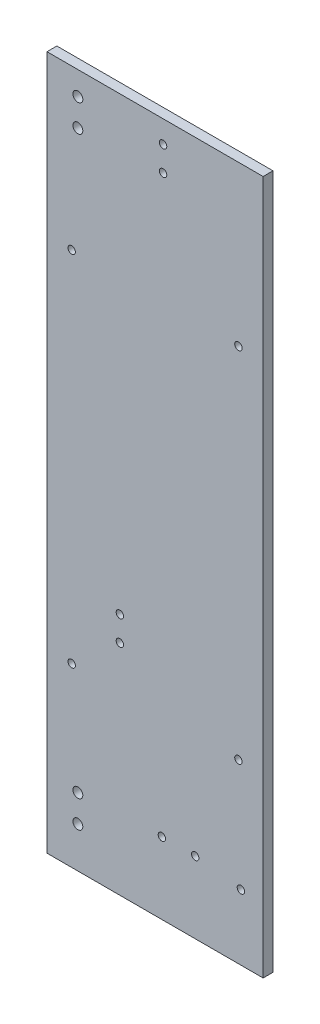
ISO-10303-21;
HEADER;
FILE_DESCRIPTION(('STEP AP214'),'2;1');
FILE_NAME('part.step','',(''),(''),'','','');
FILE_SCHEMA(('AUTOMOTIVE_DESIGN { 1 0 10303 214 1 1 1 1 }'));
ENDSEC;
DATA;
#1=APPLICATION_CONTEXT('core data for automotive mechanical design processes');
#2=APPLICATION_PROTOCOL_DEFINITION('international standard','automotive_design',2000,#1);
#3=PRODUCT_CONTEXT('',#1,'mechanical');
#4=PRODUCT('Part','Part','',(#3));
#5=PRODUCT_RELATED_PRODUCT_CATEGORY('part','',(#4));
#6=PRODUCT_DEFINITION_FORMATION('','',#4);
#7=PRODUCT_DEFINITION_CONTEXT('part definition',#1,'design');
#8=PRODUCT_DEFINITION('design','',#6,#7);
#9=PRODUCT_DEFINITION_SHAPE('','',#8);
#10=(LENGTH_UNIT() NAMED_UNIT(*) SI_UNIT(.MILLI.,.METRE.));
#11=(NAMED_UNIT(*) PLANE_ANGLE_UNIT() SI_UNIT($,.RADIAN.));
#12=(NAMED_UNIT(*) SI_UNIT($,.STERADIAN.) SOLID_ANGLE_UNIT());
#13=UNCERTAINTY_MEASURE_WITH_UNIT(LENGTH_MEASURE(1.E-05),#10,'distance_accuracy_value','');
#14=(GEOMETRIC_REPRESENTATION_CONTEXT(3) GLOBAL_UNCERTAINTY_ASSIGNED_CONTEXT((#13)) GLOBAL_UNIT_ASSIGNED_CONTEXT((#10,
#11,#12)) REPRESENTATION_CONTEXT('',''));
#15=CARTESIAN_POINT('',(0.,0.,0.));
#16=DIRECTION('',(0.,0.,1.));
#17=DIRECTION('',(1.,0.,0.));
#18=AXIS2_PLACEMENT_3D('',#15,#16,#17);
#19=CARTESIAN_POINT('',(-17.0907916429936,-246.819578947368,4.));
#20=DIRECTION('',(0.,0.,1.));
#21=DIRECTION('',(1.,0.,0.));
#22=AXIS2_PLACEMENT_3D('',#19,#20,#21);
#23=PLANE('',#22);
#24=CARTESIAN_POINT('',(12.4092083570064,-148.319578947368,4.));
#25=DIRECTION('',(0.,0.,1.));
#26=DIRECTION('',(1.,0.,0.));
#27=AXIS2_PLACEMENT_3D('',#24,#25,#26);
#28=CIRCLE('',#27,1.5);
#29=CARTESIAN_POINT('',(13.9092083570064,-148.319578947368,4.));
#30=VERTEX_POINT('',#29);
#31=EDGE_CURVE('E184',#30,#30,#28,.T.);
#32=ORIENTED_EDGE('',*,*,#31,.F.);
#33=EDGE_LOOP('',(#32));
#34=FACE_BOUND('',#33,.T.);
#35=CARTESIAN_POINT('',(29.9092083570063,25.1804210526316,4.));
#36=DIRECTION('',(0.,0.,1.));
#37=DIRECTION('',(1.,0.,0.));
#38=AXIS2_PLACEMENT_3D('',#35,#36,#37);
#39=CIRCLE('',#38,1.5);
#40=CARTESIAN_POINT('',(31.4092083570063,25.1804210526316,4.));
#41=VERTEX_POINT('',#40);
#42=EDGE_CURVE('E172',#41,#41,#39,.T.);
#43=ORIENTED_EDGE('',*,*,#42,.F.);
#44=EDGE_LOOP('',(#43));
#45=FACE_BOUND('',#44,.T.);
#46=CARTESIAN_POINT('',(-4.59079164299366,24.6804210526316,4.));
#47=DIRECTION('',(0.,0.,1.));
#48=DIRECTION('',(1.,0.,0.));
#49=AXIS2_PLACEMENT_3D('',#46,#47,#48);
#50=CIRCLE('',#49,2.);
#51=CARTESIAN_POINT('',(-2.59079164299365,24.6804210526316,4.));
#52=VERTEX_POINT('',#51);
#53=EDGE_CURVE('E160',#52,#52,#50,.T.);
#54=ORIENTED_EDGE('',*,*,#53,.F.);
#55=EDGE_LOOP('',(#54));
#56=FACE_BOUND('',#55,.T.);
#57=CARTESIAN_POINT('',(-4.59079164299362,-219.319578947368,4.));
#58=DIRECTION('',(0.,0.,1.));
#59=DIRECTION('',(1.,0.,0.));
#60=AXIS2_PLACEMENT_3D('',#57,#58,#59);
#61=CIRCLE('',#60,2.);
#62=CARTESIAN_POINT('',(-2.59079164299362,-219.319578947368,4.));
#63=VERTEX_POINT('',#62);
#64=EDGE_CURVE('E148',#63,#63,#61,.T.);
#65=ORIENTED_EDGE('',*,*,#64,.F.);
#66=EDGE_LOOP('',(#65));
#67=FACE_BOUND('',#66,.T.);
#68=CARTESIAN_POINT('',(29.4092083570064,-217.819578947368,4.));
#69=DIRECTION('',(0.,0.,1.));
#70=DIRECTION('',(1.,0.,0.));
#71=AXIS2_PLACEMENT_3D('',#68,#69,#70);
#72=CIRCLE('',#71,1.5);
#73=CARTESIAN_POINT('',(30.9092083570064,-217.819578947368,4.));
#74=VERTEX_POINT('',#73);
#75=EDGE_CURVE('E136',#74,#74,#72,.T.);
#76=ORIENTED_EDGE('',*,*,#75,.F.);
#77=EDGE_LOOP('',(#76));
#78=FACE_BOUND('',#77,.T.);
#79=CARTESIAN_POINT('',(60.4092083570064,-175.319578947368,4.));
#80=DIRECTION('',(0.,0.,1.));
#81=DIRECTION('',(1.,0.,0.));
#82=AXIS2_PLACEMENT_3D('',#79,#80,#81);
#83=CIRCLE('',#82,1.5);
#84=CARTESIAN_POINT('',(61.9092083570064,-175.319578947368,4.));
#85=VERTEX_POINT('',#84);
#86=EDGE_CURVE('E124',#85,#85,#83,.T.);
#87=ORIENTED_EDGE('',*,*,#86,.F.);
#88=EDGE_LOOP('',(#87));
#89=FACE_BOUND('',#88,.T.);
#90=CARTESIAN_POINT('',(-7.09079164299365,-30.3195789473684,4.));
#91=DIRECTION('',(0.,0.,1.));
#92=DIRECTION('',(1.,0.,0.));
#93=AXIS2_PLACEMENT_3D('',#90,#91,#92);
#94=CIRCLE('',#93,1.5);
#95=CARTESIAN_POINT('',(-5.59079164299365,-30.3195789473684,4.));
#96=VERTEX_POINT('',#95);
#97=EDGE_CURVE('E112',#96,#96,#94,.T.);
#98=ORIENTED_EDGE('',*,*,#97,.F.);
#99=EDGE_LOOP('',(#98));
#100=FACE_BOUND('',#99,.T.);
#101=DIRECTION('',(0.,-1.,0.));
#102=VECTOR('',#101,1.);
#103=CARTESIAN_POINT('',(-17.0907916429937,34.1804210526316,4.));
#104=LINE('',#103,#102);
#105=CARTESIAN_POINT('',(-17.0907916429937,34.1804210526316,4.));
#106=VERTEX_POINT('',#105);
#107=CARTESIAN_POINT('',(-17.0907916429936,-246.819578947368,4.));
#108=VERTEX_POINT('',#107);
#109=EDGE_CURVE('E82',#106,#108,#104,.T.);
#110=ORIENTED_EDGE('',*,*,#109,.T.);
#111=DIRECTION('',(1.,0.,0.));
#112=VECTOR('',#111,1.);
#113=CARTESIAN_POINT('',(-17.0907916429936,-246.819578947368,4.));
#114=LINE('',#113,#112);
#115=CARTESIAN_POINT('',(70.4092083570064,-246.819578947368,4.));
#116=VERTEX_POINT('',#115);
#117=EDGE_CURVE('E77',#108,#116,#114,.T.);
#118=ORIENTED_EDGE('',*,*,#117,.T.);
#119=DIRECTION('',(0.,1.,0.));
#120=VECTOR('',#119,1.);
#121=CARTESIAN_POINT('',(70.4092083570063,34.1804210526316,4.));
#122=LINE('',#121,#120);
#123=CARTESIAN_POINT('',(70.4092083570063,34.1804210526316,4.));
#124=VERTEX_POINT('',#123);
#125=EDGE_CURVE('E80',#116,#124,#122,.T.);
#126=ORIENTED_EDGE('',*,*,#125,.T.);
#127=DIRECTION('',(-1.,0.,0.));
#128=VECTOR('',#127,1.);
#129=CARTESIAN_POINT('',(-17.0907916429937,34.1804210526316,4.));
#130=LINE('',#129,#128);
#131=EDGE_CURVE('E47',#124,#106,#130,.T.);
#132=ORIENTED_EDGE('',*,*,#131,.T.);
#133=EDGE_LOOP('',(#110,#118,#126,#132));
#134=FACE_BOUND('',#133,.T.);
#135=CARTESIAN_POINT('',(-7.09079164299363,-175.319578947368,4.));
#136=DIRECTION('',(0.,0.,1.));
#137=DIRECTION('',(1.,0.,0.));
#138=AXIS2_PLACEMENT_3D('',#135,#136,#137);
#139=CIRCLE('',#138,1.5);
#140=CARTESIAN_POINT('',(-5.59079164299363,-175.319578947368,4.));
#141=VERTEX_POINT('',#140);
#142=EDGE_CURVE('E97',#141,#141,#139,.T.);
#143=ORIENTED_EDGE('',*,*,#142,.F.);
#144=EDGE_LOOP('',(#143));
#145=FACE_BOUND('',#144,.T.);
#146=CARTESIAN_POINT('',(60.4092083570064,-30.3195789473684,4.));
#147=DIRECTION('',(0.,0.,1.));
#148=DIRECTION('',(1.,0.,0.));
#149=AXIS2_PLACEMENT_3D('',#146,#147,#148);
#150=CIRCLE('',#149,1.5);
#151=CARTESIAN_POINT('',(61.9092083570064,-30.3195789473684,4.));
#152=VERTEX_POINT('',#151);
#153=EDGE_CURVE('E118',#152,#152,#150,.T.);
#154=ORIENTED_EDGE('',*,*,#153,.F.);
#155=EDGE_LOOP('',(#154));
#156=FACE_BOUND('',#155,.T.);
#157=CARTESIAN_POINT('',(42.9092083570064,-217.819578947368,4.));
#158=DIRECTION('',(0.,0.,1.));
#159=DIRECTION('',(1.,0.,0.));
#160=AXIS2_PLACEMENT_3D('',#157,#158,#159);
#161=CIRCLE('',#160,1.5);
#162=CARTESIAN_POINT('',(44.4092083570064,-217.819578947368,4.));
#163=VERTEX_POINT('',#162);
#164=EDGE_CURVE('E130',#163,#163,#161,.T.);
#165=ORIENTED_EDGE('',*,*,#164,.F.);
#166=EDGE_LOOP('',(#165));
#167=FACE_BOUND('',#166,.T.);
#168=CARTESIAN_POINT('',(61.4092083570064,-220.319578947368,4.));
#169=DIRECTION('',(0.,0.,1.));
#170=DIRECTION('',(1.,0.,0.));
#171=AXIS2_PLACEMENT_3D('',#168,#169,#170);
#172=CIRCLE('',#171,1.49999999999999);
#173=CARTESIAN_POINT('',(62.9092083570064,-220.319578947368,4.));
#174=VERTEX_POINT('',#173);
#175=EDGE_CURVE('E142',#174,#174,#172,.T.);
#176=ORIENTED_EDGE('',*,*,#175,.F.);
#177=EDGE_LOOP('',(#176));
#178=FACE_BOUND('',#177,.T.);
#179=CARTESIAN_POINT('',(-4.59079164299362,-230.319578947368,4.));
#180=DIRECTION('',(0.,0.,1.));
#181=DIRECTION('',(1.,0.,0.));
#182=AXIS2_PLACEMENT_3D('',#179,#180,#181);
#183=CIRCLE('',#182,2.);
#184=CARTESIAN_POINT('',(-2.59079164299362,-230.319578947368,4.));
#185=VERTEX_POINT('',#184);
#186=EDGE_CURVE('E154',#185,#185,#183,.T.);
#187=ORIENTED_EDGE('',*,*,#186,.F.);
#188=EDGE_LOOP('',(#187));
#189=FACE_BOUND('',#188,.T.);
#190=CARTESIAN_POINT('',(-4.59079164299365,13.6804210526316,4.));
#191=DIRECTION('',(0.,0.,1.));
#192=DIRECTION('',(1.,0.,0.));
#193=AXIS2_PLACEMENT_3D('',#190,#191,#192);
#194=CIRCLE('',#193,2.);
#195=CARTESIAN_POINT('',(-2.59079164299365,13.6804210526316,4.));
#196=VERTEX_POINT('',#195);
#197=EDGE_CURVE('E166',#196,#196,#194,.T.);
#198=ORIENTED_EDGE('',*,*,#197,.F.);
#199=EDGE_LOOP('',(#198));
#200=FACE_BOUND('',#199,.T.);
#201=CARTESIAN_POINT('',(29.9092083570063,15.1804210526316,4.));
#202=DIRECTION('',(0.,0.,1.));
#203=DIRECTION('',(1.,0.,0.));
#204=AXIS2_PLACEMENT_3D('',#201,#202,#203);
#205=CIRCLE('',#204,1.5);
#206=CARTESIAN_POINT('',(31.4092083570063,15.1804210526316,4.));
#207=VERTEX_POINT('',#206);
#208=EDGE_CURVE('E178',#207,#207,#205,.T.);
#209=ORIENTED_EDGE('',*,*,#208,.F.);
#210=EDGE_LOOP('',(#209));
#211=FACE_BOUND('',#210,.T.);
#212=CARTESIAN_POINT('',(12.4092083570064,-158.319578947368,4.));
#213=DIRECTION('',(0.,0.,1.));
#214=DIRECTION('',(1.,0.,0.));
#215=AXIS2_PLACEMENT_3D('',#212,#213,#214);
#216=CIRCLE('',#215,1.5);
#217=CARTESIAN_POINT('',(13.9092083570064,-158.319578947368,4.));
#218=VERTEX_POINT('',#217);
#219=EDGE_CURVE('E190',#218,#218,#216,.T.);
#220=ORIENTED_EDGE('',*,*,#219,.F.);
#221=EDGE_LOOP('',(#220));
#222=FACE_BOUND('',#221,.T.);
#223=ADVANCED_FACE('F30',(#34,#45,#56,#67,#78,#89,#100,#134,#145,#156,#167,#178,#189,#200,#211,
#222),#23,.T.);
#224=CARTESIAN_POINT('',(-17.0907916429936,-246.819578947368,0.));
#225=DIRECTION('',(0.,0.,1.));
#226=DIRECTION('',(1.,0.,0.));
#227=AXIS2_PLACEMENT_3D('',#224,#225,#226);
#228=PLANE('',#227);
#229=CARTESIAN_POINT('',(12.4092083570064,-148.319578947368,0.));
#230=DIRECTION('',(0.,0.,1.));
#231=DIRECTION('',(1.,0.,0.));
#232=AXIS2_PLACEMENT_3D('',#229,#230,#231);
#233=CIRCLE('',#232,1.5);
#234=CARTESIAN_POINT('',(13.9092083570064,-148.319578947368,0.));
#235=VERTEX_POINT('',#234);
#236=EDGE_CURVE('E187',#235,#235,#233,.T.);
#237=ORIENTED_EDGE('',*,*,#236,.T.);
#238=EDGE_LOOP('',(#237));
#239=FACE_BOUND('',#238,.T.);
#240=CARTESIAN_POINT('',(29.9092083570063,25.1804210526316,0.));
#241=DIRECTION('',(0.,0.,1.));
#242=DIRECTION('',(1.,0.,0.));
#243=AXIS2_PLACEMENT_3D('',#240,#241,#242);
#244=CIRCLE('',#243,1.5);
#245=CARTESIAN_POINT('',(31.4092083570063,25.1804210526316,0.));
#246=VERTEX_POINT('',#245);
#247=EDGE_CURVE('E175',#246,#246,#244,.T.);
#248=ORIENTED_EDGE('',*,*,#247,.T.);
#249=EDGE_LOOP('',(#248));
#250=FACE_BOUND('',#249,.T.);
#251=CARTESIAN_POINT('',(-4.59079164299366,24.6804210526316,0.));
#252=DIRECTION('',(0.,0.,1.));
#253=DIRECTION('',(1.,0.,0.));
#254=AXIS2_PLACEMENT_3D('',#251,#252,#253);
#255=CIRCLE('',#254,2.);
#256=CARTESIAN_POINT('',(-2.59079164299365,24.6804210526316,0.));
#257=VERTEX_POINT('',#256);
#258=EDGE_CURVE('E163',#257,#257,#255,.T.);
#259=ORIENTED_EDGE('',*,*,#258,.T.);
#260=EDGE_LOOP('',(#259));
#261=FACE_BOUND('',#260,.T.);
#262=CARTESIAN_POINT('',(-4.59079164299362,-219.319578947368,0.));
#263=DIRECTION('',(0.,0.,1.));
#264=DIRECTION('',(1.,0.,0.));
#265=AXIS2_PLACEMENT_3D('',#262,#263,#264);
#266=CIRCLE('',#265,2.);
#267=CARTESIAN_POINT('',(-2.59079164299362,-219.319578947368,0.));
#268=VERTEX_POINT('',#267);
#269=EDGE_CURVE('E151',#268,#268,#266,.T.);
#270=ORIENTED_EDGE('',*,*,#269,.T.);
#271=EDGE_LOOP('',(#270));
#272=FACE_BOUND('',#271,.T.);
#273=CARTESIAN_POINT('',(29.4092083570064,-217.819578947368,0.));
#274=DIRECTION('',(0.,0.,1.));
#275=DIRECTION('',(1.,0.,0.));
#276=AXIS2_PLACEMENT_3D('',#273,#274,#275);
#277=CIRCLE('',#276,1.5);
#278=CARTESIAN_POINT('',(30.9092083570064,-217.819578947368,0.));
#279=VERTEX_POINT('',#278);
#280=EDGE_CURVE('E139',#279,#279,#277,.T.);
#281=ORIENTED_EDGE('',*,*,#280,.T.);
#282=EDGE_LOOP('',(#281));
#283=FACE_BOUND('',#282,.T.);
#284=CARTESIAN_POINT('',(60.4092083570064,-175.319578947368,0.));
#285=DIRECTION('',(0.,0.,1.));
#286=DIRECTION('',(1.,0.,0.));
#287=AXIS2_PLACEMENT_3D('',#284,#285,#286);
#288=CIRCLE('',#287,1.5);
#289=CARTESIAN_POINT('',(61.9092083570064,-175.319578947368,0.));
#290=VERTEX_POINT('',#289);
#291=EDGE_CURVE('E127',#290,#290,#288,.T.);
#292=ORIENTED_EDGE('',*,*,#291,.T.);
#293=EDGE_LOOP('',(#292));
#294=FACE_BOUND('',#293,.T.);
#295=CARTESIAN_POINT('',(-7.09079164299365,-30.3195789473684,0.));
#296=DIRECTION('',(0.,0.,1.));
#297=DIRECTION('',(1.,0.,0.));
#298=AXIS2_PLACEMENT_3D('',#295,#296,#297);
#299=CIRCLE('',#298,1.5);
#300=CARTESIAN_POINT('',(-5.59079164299365,-30.3195789473684,0.));
#301=VERTEX_POINT('',#300);
#302=EDGE_CURVE('E115',#301,#301,#299,.T.);
#303=ORIENTED_EDGE('',*,*,#302,.T.);
#304=EDGE_LOOP('',(#303));
#305=FACE_BOUND('',#304,.T.);
#306=DIRECTION('',(0.,-1.,0.));
#307=VECTOR('',#306,1.);
#308=CARTESIAN_POINT('',(-17.0907916429937,34.1804210526316,0.));
#309=LINE('',#308,#307);
#310=CARTESIAN_POINT('',(-17.0907916429937,34.1804210526316,0.));
#311=VERTEX_POINT('',#310);
#312=CARTESIAN_POINT('',(-17.0907916429936,-246.819578947368,0.));
#313=VERTEX_POINT('',#312);
#314=EDGE_CURVE('E94',#311,#313,#309,.T.);
#315=ORIENTED_EDGE('',*,*,#314,.F.);
#316=DIRECTION('',(-1.,0.,0.));
#317=VECTOR('',#316,1.);
#318=CARTESIAN_POINT('',(-17.0907916429937,34.1804210526316,0.));
#319=LINE('',#318,#317);
#320=CARTESIAN_POINT('',(70.4092083570063,34.1804210526316,0.));
#321=VERTEX_POINT('',#320);
#322=EDGE_CURVE('E70',#321,#311,#319,.T.);
#323=ORIENTED_EDGE('',*,*,#322,.F.);
#324=DIRECTION('',(0.,1.,0.));
#325=VECTOR('',#324,1.);
#326=CARTESIAN_POINT('',(70.4092083570063,34.1804210526316,0.));
#327=LINE('',#326,#325);
#328=CARTESIAN_POINT('',(70.4092083570064,-246.819578947368,0.));
#329=VERTEX_POINT('',#328);
#330=EDGE_CURVE('E64',#329,#321,#327,.T.);
#331=ORIENTED_EDGE('',*,*,#330,.F.);
#332=DIRECTION('',(1.,0.,0.));
#333=VECTOR('',#332,1.);
#334=CARTESIAN_POINT('',(-17.0907916429936,-246.819578947368,0.));
#335=LINE('',#334,#333);
#336=EDGE_CURVE('E86',#313,#329,#335,.T.);
#337=ORIENTED_EDGE('',*,*,#336,.F.);
#338=EDGE_LOOP('',(#315,#323,#331,#337));
#339=FACE_BOUND('',#338,.T.);
#340=CARTESIAN_POINT('',(-7.09079164299363,-175.319578947368,0.));
#341=DIRECTION('',(0.,0.,1.));
#342=DIRECTION('',(1.,0.,0.));
#343=AXIS2_PLACEMENT_3D('',#340,#341,#342);
#344=CIRCLE('',#343,1.5);
#345=CARTESIAN_POINT('',(-5.59079164299363,-175.319578947368,0.));
#346=VERTEX_POINT('',#345);
#347=EDGE_CURVE('E109',#346,#346,#344,.T.);
#348=ORIENTED_EDGE('',*,*,#347,.T.);
#349=EDGE_LOOP('',(#348));
#350=FACE_BOUND('',#349,.T.);
#351=CARTESIAN_POINT('',(60.4092083570064,-30.3195789473684,0.));
#352=DIRECTION('',(0.,0.,1.));
#353=DIRECTION('',(1.,0.,0.));
#354=AXIS2_PLACEMENT_3D('',#351,#352,#353);
#355=CIRCLE('',#354,1.5);
#356=CARTESIAN_POINT('',(61.9092083570064,-30.3195789473684,0.));
#357=VERTEX_POINT('',#356);
#358=EDGE_CURVE('E121',#357,#357,#355,.T.);
#359=ORIENTED_EDGE('',*,*,#358,.T.);
#360=EDGE_LOOP('',(#359));
#361=FACE_BOUND('',#360,.T.);
#362=CARTESIAN_POINT('',(42.9092083570064,-217.819578947368,0.));
#363=DIRECTION('',(0.,0.,1.));
#364=DIRECTION('',(1.,0.,0.));
#365=AXIS2_PLACEMENT_3D('',#362,#363,#364);
#366=CIRCLE('',#365,1.5);
#367=CARTESIAN_POINT('',(44.4092083570064,-217.819578947368,0.));
#368=VERTEX_POINT('',#367);
#369=EDGE_CURVE('E133',#368,#368,#366,.T.);
#370=ORIENTED_EDGE('',*,*,#369,.T.);
#371=EDGE_LOOP('',(#370));
#372=FACE_BOUND('',#371,.T.);
#373=CARTESIAN_POINT('',(61.4092083570064,-220.319578947368,0.));
#374=DIRECTION('',(0.,0.,1.));
#375=DIRECTION('',(1.,0.,0.));
#376=AXIS2_PLACEMENT_3D('',#373,#374,#375);
#377=CIRCLE('',#376,1.49999999999999);
#378=CARTESIAN_POINT('',(62.9092083570064,-220.319578947368,0.));
#379=VERTEX_POINT('',#378);
#380=EDGE_CURVE('E145',#379,#379,#377,.T.);
#381=ORIENTED_EDGE('',*,*,#380,.T.);
#382=EDGE_LOOP('',(#381));
#383=FACE_BOUND('',#382,.T.);
#384=CARTESIAN_POINT('',(-4.59079164299362,-230.319578947368,0.));
#385=DIRECTION('',(0.,0.,1.));
#386=DIRECTION('',(1.,0.,0.));
#387=AXIS2_PLACEMENT_3D('',#384,#385,#386);
#388=CIRCLE('',#387,2.);
#389=CARTESIAN_POINT('',(-2.59079164299362,-230.319578947368,0.));
#390=VERTEX_POINT('',#389);
#391=EDGE_CURVE('E157',#390,#390,#388,.T.);
#392=ORIENTED_EDGE('',*,*,#391,.T.);
#393=EDGE_LOOP('',(#392));
#394=FACE_BOUND('',#393,.T.);
#395=CARTESIAN_POINT('',(-4.59079164299365,13.6804210526316,0.));
#396=DIRECTION('',(0.,0.,1.));
#397=DIRECTION('',(1.,0.,0.));
#398=AXIS2_PLACEMENT_3D('',#395,#396,#397);
#399=CIRCLE('',#398,2.);
#400=CARTESIAN_POINT('',(-2.59079164299365,13.6804210526316,0.));
#401=VERTEX_POINT('',#400);
#402=EDGE_CURVE('E169',#401,#401,#399,.T.);
#403=ORIENTED_EDGE('',*,*,#402,.T.);
#404=EDGE_LOOP('',(#403));
#405=FACE_BOUND('',#404,.T.);
#406=CARTESIAN_POINT('',(29.9092083570063,15.1804210526316,0.));
#407=DIRECTION('',(0.,0.,1.));
#408=DIRECTION('',(1.,0.,0.));
#409=AXIS2_PLACEMENT_3D('',#406,#407,#408);
#410=CIRCLE('',#409,1.5);
#411=CARTESIAN_POINT('',(31.4092083570063,15.1804210526316,0.));
#412=VERTEX_POINT('',#411);
#413=EDGE_CURVE('E181',#412,#412,#410,.T.);
#414=ORIENTED_EDGE('',*,*,#413,.T.);
#415=EDGE_LOOP('',(#414));
#416=FACE_BOUND('',#415,.T.);
#417=CARTESIAN_POINT('',(12.4092083570064,-158.319578947368,0.));
#418=DIRECTION('',(0.,0.,1.));
#419=DIRECTION('',(1.,0.,0.));
#420=AXIS2_PLACEMENT_3D('',#417,#418,#419);
#421=CIRCLE('',#420,1.5);
#422=CARTESIAN_POINT('',(13.9092083570064,-158.319578947368,0.));
#423=VERTEX_POINT('',#422);
#424=EDGE_CURVE('E193',#423,#423,#421,.T.);
#425=ORIENTED_EDGE('',*,*,#424,.T.);
#426=EDGE_LOOP('',(#425));
#427=FACE_BOUND('',#426,.T.);
#428=ADVANCED_FACE('F105',(#239,#250,#261,#272,#283,#294,#305,#339,#350,#361,#372,#383,#394,
#405,#416,#427),#228,.F.);
#429=CARTESIAN_POINT('',(-17.0907916429937,34.1804210526316,4.));
#430=DIRECTION('',(1.,0.,0.));
#431=DIRECTION('',(0.,1.,0.));
#432=AXIS2_PLACEMENT_3D('',#429,#430,#431);
#433=PLANE('',#432);
#434=ORIENTED_EDGE('',*,*,#314,.T.);
#435=DIRECTION('',(0.,0.,-1.));
#436=VECTOR('',#435,1.);
#437=CARTESIAN_POINT('',(-17.0907916429936,-246.819578947368,4.));
#438=LINE('',#437,#436);
#439=EDGE_CURVE('E11',#108,#313,#438,.T.);
#440=ORIENTED_EDGE('',*,*,#439,.F.);
#441=ORIENTED_EDGE('',*,*,#109,.F.);
#442=DIRECTION('',(0.,0.,-1.));
#443=VECTOR('',#442,1.);
#444=CARTESIAN_POINT('',(-17.0907916429937,34.1804210526316,4.));
#445=LINE('',#444,#443);
#446=EDGE_CURVE('E90',#106,#311,#445,.T.);
#447=ORIENTED_EDGE('',*,*,#446,.T.);
#448=EDGE_LOOP('',(#434,#440,#441,#447));
#449=FACE_BOUND('',#448,.T.);
#450=ADVANCED_FACE('F32',(#449),#433,.F.);
#451=CARTESIAN_POINT('',(-17.0907916429936,-246.819578947368,4.));
#452=DIRECTION('',(0.,1.,0.));
#453=DIRECTION('',(0.,0.,1.));
#454=AXIS2_PLACEMENT_3D('',#451,#452,#453);
#455=PLANE('',#454);
#456=ORIENTED_EDGE('',*,*,#336,.T.);
#457=DIRECTION('',(0.,0.,-1.));
#458=VECTOR('',#457,1.);
#459=CARTESIAN_POINT('',(70.4092083570064,-246.819578947368,4.));
#460=LINE('',#459,#458);
#461=EDGE_CURVE('E39',#116,#329,#460,.T.);
#462=ORIENTED_EDGE('',*,*,#461,.F.);
#463=ORIENTED_EDGE('',*,*,#117,.F.);
#464=ORIENTED_EDGE('',*,*,#439,.T.);
#465=EDGE_LOOP('',(#456,#462,#463,#464));
#466=FACE_BOUND('',#465,.T.);
#467=ADVANCED_FACE('F85',(#466),#455,.F.);
#468=CARTESIAN_POINT('',(70.4092083570063,34.1804210526316,4.));
#469=DIRECTION('',(-1.,0.,0.));
#470=DIRECTION('',(0.,-1.,0.));
#471=AXIS2_PLACEMENT_3D('',#468,#469,#470);
#472=PLANE('',#471);
#473=ORIENTED_EDGE('',*,*,#330,.T.);
#474=DIRECTION('',(0.,0.,-1.));
#475=VECTOR('',#474,1.);
#476=CARTESIAN_POINT('',(70.4092083570063,34.1804210526316,4.));
#477=LINE('',#476,#475);
#478=EDGE_CURVE('E87',#124,#321,#477,.T.);
#479=ORIENTED_EDGE('',*,*,#478,.F.);
#480=ORIENTED_EDGE('',*,*,#125,.F.);
#481=ORIENTED_EDGE('',*,*,#461,.T.);
#482=EDGE_LOOP('',(#473,#479,#480,#481));
#483=FACE_BOUND('',#482,.T.);
#484=ADVANCED_FACE('F88',(#483),#472,.F.);
#485=CARTESIAN_POINT('',(-17.0907916429937,34.1804210526316,4.));
#486=DIRECTION('',(0.,-1.,0.));
#487=DIRECTION('',(0.,0.,-1.));
#488=AXIS2_PLACEMENT_3D('',#485,#486,#487);
#489=PLANE('',#488);
#490=ORIENTED_EDGE('',*,*,#322,.T.);
#491=ORIENTED_EDGE('',*,*,#446,.F.);
#492=ORIENTED_EDGE('',*,*,#131,.F.);
#493=ORIENTED_EDGE('',*,*,#478,.T.);
#494=EDGE_LOOP('',(#490,#491,#492,#493));
#495=FACE_BOUND('',#494,.T.);
#496=ADVANCED_FACE('F102',(#495),#489,.F.);
#497=CARTESIAN_POINT('',(-7.09079164299363,-175.319578947368,4.));
#498=DIRECTION('',(0.,0.,-1.));
#499=DIRECTION('',(-1.,0.,0.));
#500=AXIS2_PLACEMENT_3D('',#497,#498,#499);
#501=CYLINDRICAL_SURFACE('',#500,1.5);
#502=ORIENTED_EDGE('',*,*,#142,.T.);
#503=EDGE_LOOP('',(#502));
#504=FACE_BOUND('',#503,.T.);
#505=ORIENTED_EDGE('',*,*,#347,.F.);
#506=EDGE_LOOP('',(#505));
#507=FACE_BOUND('',#506,.T.);
#508=ADVANCED_FACE('F213',(#504,#507),#501,.F.);
#509=CARTESIAN_POINT('',(-7.09079164299365,-30.3195789473684,4.));
#510=DIRECTION('',(0.,0.,-1.));
#511=DIRECTION('',(-1.,0.,0.));
#512=AXIS2_PLACEMENT_3D('',#509,#510,#511);
#513=CYLINDRICAL_SURFACE('',#512,1.5);
#514=ORIENTED_EDGE('',*,*,#97,.T.);
#515=EDGE_LOOP('',(#514));
#516=FACE_BOUND('',#515,.T.);
#517=ORIENTED_EDGE('',*,*,#302,.F.);
#518=EDGE_LOOP('',(#517));
#519=FACE_BOUND('',#518,.T.);
#520=ADVANCED_FACE('F259',(#516,#519),#513,.F.);
#521=CARTESIAN_POINT('',(60.4092083570064,-30.3195789473684,4.));
#522=DIRECTION('',(0.,0.,-1.));
#523=DIRECTION('',(-1.,0.,0.));
#524=AXIS2_PLACEMENT_3D('',#521,#522,#523);
#525=CYLINDRICAL_SURFACE('',#524,1.5);
#526=ORIENTED_EDGE('',*,*,#153,.T.);
#527=EDGE_LOOP('',(#526));
#528=FACE_BOUND('',#527,.T.);
#529=ORIENTED_EDGE('',*,*,#358,.F.);
#530=EDGE_LOOP('',(#529));
#531=FACE_BOUND('',#530,.T.);
#532=ADVANCED_FACE('F267',(#528,#531),#525,.F.);
#533=CARTESIAN_POINT('',(60.4092083570064,-175.319578947368,4.));
#534=DIRECTION('',(0.,0.,-1.));
#535=DIRECTION('',(-1.,0.,0.));
#536=AXIS2_PLACEMENT_3D('',#533,#534,#535);
#537=CYLINDRICAL_SURFACE('',#536,1.5);
#538=ORIENTED_EDGE('',*,*,#86,.T.);
#539=EDGE_LOOP('',(#538));
#540=FACE_BOUND('',#539,.T.);
#541=ORIENTED_EDGE('',*,*,#291,.F.);
#542=EDGE_LOOP('',(#541));
#543=FACE_BOUND('',#542,.T.);
#544=ADVANCED_FACE('F275',(#540,#543),#537,.F.);
#545=CARTESIAN_POINT('',(42.9092083570064,-217.819578947368,4.));
#546=DIRECTION('',(0.,0.,-1.));
#547=DIRECTION('',(-1.,0.,0.));
#548=AXIS2_PLACEMENT_3D('',#545,#546,#547);
#549=CYLINDRICAL_SURFACE('',#548,1.5);
#550=ORIENTED_EDGE('',*,*,#164,.T.);
#551=EDGE_LOOP('',(#550));
#552=FACE_BOUND('',#551,.T.);
#553=ORIENTED_EDGE('',*,*,#369,.F.);
#554=EDGE_LOOP('',(#553));
#555=FACE_BOUND('',#554,.T.);
#556=ADVANCED_FACE('F284',(#552,#555),#549,.F.);
#557=CARTESIAN_POINT('',(29.4092083570064,-217.819578947368,4.));
#558=DIRECTION('',(0.,0.,-1.));
#559=DIRECTION('',(-1.,0.,0.));
#560=AXIS2_PLACEMENT_3D('',#557,#558,#559);
#561=CYLINDRICAL_SURFACE('',#560,1.5);
#562=ORIENTED_EDGE('',*,*,#75,.T.);
#563=EDGE_LOOP('',(#562));
#564=FACE_BOUND('',#563,.T.);
#565=ORIENTED_EDGE('',*,*,#280,.F.);
#566=EDGE_LOOP('',(#565));
#567=FACE_BOUND('',#566,.T.);
#568=ADVANCED_FACE('F293',(#564,#567),#561,.F.);
#569=CARTESIAN_POINT('',(61.4092083570064,-220.319578947368,4.));
#570=DIRECTION('',(0.,0.,-1.));
#571=DIRECTION('',(-1.,0.,0.));
#572=AXIS2_PLACEMENT_3D('',#569,#570,#571);
#573=CYLINDRICAL_SURFACE('',#572,1.49999999999999);
#574=ORIENTED_EDGE('',*,*,#175,.T.);
#575=EDGE_LOOP('',(#574));
#576=FACE_BOUND('',#575,.T.);
#577=ORIENTED_EDGE('',*,*,#380,.F.);
#578=EDGE_LOOP('',(#577));
#579=FACE_BOUND('',#578,.T.);
#580=ADVANCED_FACE('F302',(#576,#579),#573,.F.);
#581=CARTESIAN_POINT('',(-4.59079164299362,-219.319578947368,4.));
#582=DIRECTION('',(0.,0.,-1.));
#583=DIRECTION('',(-1.,0.,0.));
#584=AXIS2_PLACEMENT_3D('',#581,#582,#583);
#585=CYLINDRICAL_SURFACE('',#584,2.);
#586=ORIENTED_EDGE('',*,*,#64,.T.);
#587=EDGE_LOOP('',(#586));
#588=FACE_BOUND('',#587,.T.);
#589=ORIENTED_EDGE('',*,*,#269,.F.);
#590=EDGE_LOOP('',(#589));
#591=FACE_BOUND('',#590,.T.);
#592=ADVANCED_FACE('F311',(#588,#591),#585,.F.);
#593=CARTESIAN_POINT('',(-4.59079164299362,-230.319578947368,4.));
#594=DIRECTION('',(0.,0.,-1.));
#595=DIRECTION('',(-1.,0.,0.));
#596=AXIS2_PLACEMENT_3D('',#593,#594,#595);
#597=CYLINDRICAL_SURFACE('',#596,2.);
#598=ORIENTED_EDGE('',*,*,#186,.T.);
#599=EDGE_LOOP('',(#598));
#600=FACE_BOUND('',#599,.T.);
#601=ORIENTED_EDGE('',*,*,#391,.F.);
#602=EDGE_LOOP('',(#601));
#603=FACE_BOUND('',#602,.T.);
#604=ADVANCED_FACE('F320',(#600,#603),#597,.F.);
#605=CARTESIAN_POINT('',(-4.59079164299366,24.6804210526316,4.));
#606=DIRECTION('',(0.,0.,-1.));
#607=DIRECTION('',(-1.,0.,0.));
#608=AXIS2_PLACEMENT_3D('',#605,#606,#607);
#609=CYLINDRICAL_SURFACE('',#608,2.);
#610=ORIENTED_EDGE('',*,*,#53,.T.);
#611=EDGE_LOOP('',(#610));
#612=FACE_BOUND('',#611,.T.);
#613=ORIENTED_EDGE('',*,*,#258,.F.);
#614=EDGE_LOOP('',(#613));
#615=FACE_BOUND('',#614,.T.);
#616=ADVANCED_FACE('F329',(#612,#615),#609,.F.);
#617=CARTESIAN_POINT('',(-4.59079164299365,13.6804210526316,4.));
#618=DIRECTION('',(0.,0.,-1.));
#619=DIRECTION('',(-1.,0.,0.));
#620=AXIS2_PLACEMENT_3D('',#617,#618,#619);
#621=CYLINDRICAL_SURFACE('',#620,2.);
#622=ORIENTED_EDGE('',*,*,#197,.T.);
#623=EDGE_LOOP('',(#622));
#624=FACE_BOUND('',#623,.T.);
#625=ORIENTED_EDGE('',*,*,#402,.F.);
#626=EDGE_LOOP('',(#625));
#627=FACE_BOUND('',#626,.T.);
#628=ADVANCED_FACE('F338',(#624,#627),#621,.F.);
#629=CARTESIAN_POINT('',(29.9092083570063,25.1804210526316,4.));
#630=DIRECTION('',(0.,0.,-1.));
#631=DIRECTION('',(-1.,0.,0.));
#632=AXIS2_PLACEMENT_3D('',#629,#630,#631);
#633=CYLINDRICAL_SURFACE('',#632,1.5);
#634=ORIENTED_EDGE('',*,*,#42,.T.);
#635=EDGE_LOOP('',(#634));
#636=FACE_BOUND('',#635,.T.);
#637=ORIENTED_EDGE('',*,*,#247,.F.);
#638=EDGE_LOOP('',(#637));
#639=FACE_BOUND('',#638,.T.);
#640=ADVANCED_FACE('F347',(#636,#639),#633,.F.);
#641=CARTESIAN_POINT('',(29.9092083570063,15.1804210526316,4.));
#642=DIRECTION('',(0.,0.,-1.));
#643=DIRECTION('',(-1.,0.,0.));
#644=AXIS2_PLACEMENT_3D('',#641,#642,#643);
#645=CYLINDRICAL_SURFACE('',#644,1.5);
#646=ORIENTED_EDGE('',*,*,#208,.T.);
#647=EDGE_LOOP('',(#646));
#648=FACE_BOUND('',#647,.T.);
#649=ORIENTED_EDGE('',*,*,#413,.F.);
#650=EDGE_LOOP('',(#649));
#651=FACE_BOUND('',#650,.T.);
#652=ADVANCED_FACE('F356',(#648,#651),#645,.F.);
#653=CARTESIAN_POINT('',(12.4092083570064,-148.319578947368,4.));
#654=DIRECTION('',(0.,0.,-1.));
#655=DIRECTION('',(-1.,0.,0.));
#656=AXIS2_PLACEMENT_3D('',#653,#654,#655);
#657=CYLINDRICAL_SURFACE('',#656,1.5);
#658=ORIENTED_EDGE('',*,*,#31,.T.);
#659=EDGE_LOOP('',(#658));
#660=FACE_BOUND('',#659,.T.);
#661=ORIENTED_EDGE('',*,*,#236,.F.);
#662=EDGE_LOOP('',(#661));
#663=FACE_BOUND('',#662,.T.);
#664=ADVANCED_FACE('F365',(#660,#663),#657,.F.);
#665=CARTESIAN_POINT('',(12.4092083570064,-158.319578947368,4.));
#666=DIRECTION('',(0.,0.,-1.));
#667=DIRECTION('',(-1.,0.,0.));
#668=AXIS2_PLACEMENT_3D('',#665,#666,#667);
#669=CYLINDRICAL_SURFACE('',#668,1.5);
#670=ORIENTED_EDGE('',*,*,#219,.T.);
#671=EDGE_LOOP('',(#670));
#672=FACE_BOUND('',#671,.T.);
#673=ORIENTED_EDGE('',*,*,#424,.F.);
#674=EDGE_LOOP('',(#673));
#675=FACE_BOUND('',#674,.T.);
#676=ADVANCED_FACE('F199',(#672,#675),#669,.F.);
#677=CLOSED_SHELL('',(#223,#428,#450,#467,#484,#496,#508,#520,#532,#544,#556,#568,#580,#592,
#604,#616,#628,#640,#652,#664,#676));
#678=MANIFOLD_SOLID_BREP('B2',#677);
#679=ADVANCED_BREP_SHAPE_REPRESENTATION('',(#18,#678),#14);
#680=SHAPE_DEFINITION_REPRESENTATION(#9,#679);
ENDSEC;
END-ISO-10303-21;
